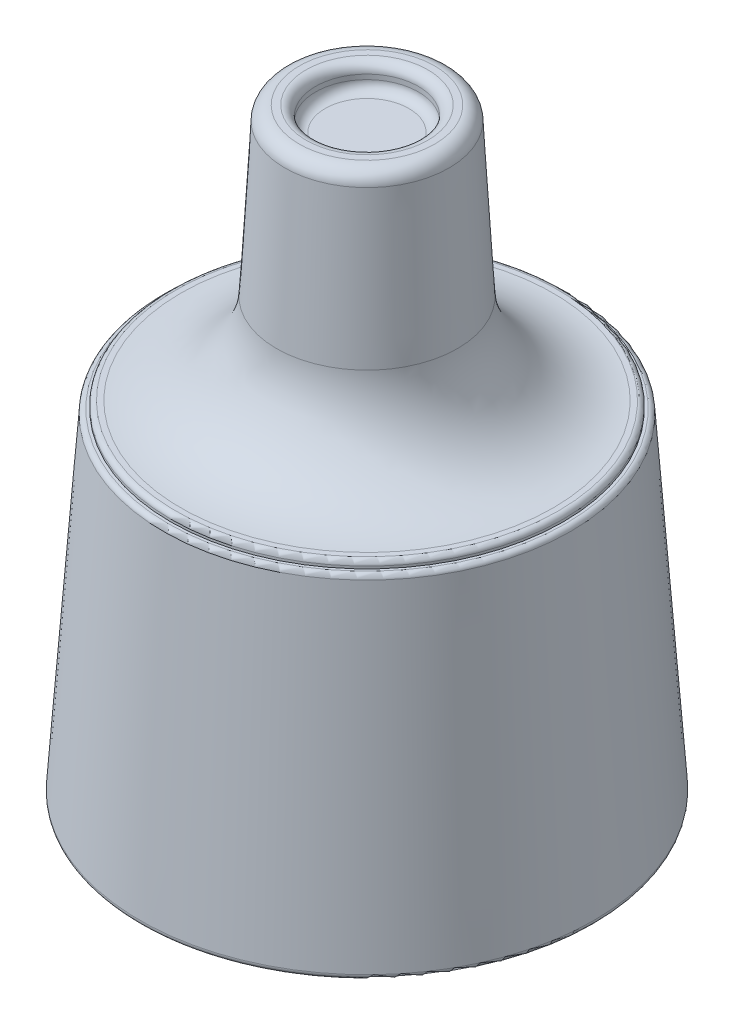
ISO-10303-21;
HEADER;
FILE_DESCRIPTION(('STEP AP214'),'2;1');
FILE_NAME('part.step','',(''),(''),'','','');
FILE_SCHEMA(('AUTOMOTIVE_DESIGN { 1 0 10303 214 1 1 1 1 }'));
ENDSEC;
DATA;
#1=APPLICATION_CONTEXT('core data for automotive mechanical design processes');
#2=APPLICATION_PROTOCOL_DEFINITION('international standard','automotive_design',2000,#1);
#3=PRODUCT_CONTEXT('',#1,'mechanical');
#4=PRODUCT('Part','Part','',(#3));
#5=PRODUCT_RELATED_PRODUCT_CATEGORY('part','',(#4));
#6=PRODUCT_DEFINITION_FORMATION('','',#4);
#7=PRODUCT_DEFINITION_CONTEXT('part definition',#1,'design');
#8=PRODUCT_DEFINITION('design','',#6,#7);
#9=PRODUCT_DEFINITION_SHAPE('','',#8);
#10=(LENGTH_UNIT() NAMED_UNIT(*) SI_UNIT(.MILLI.,.METRE.));
#11=(NAMED_UNIT(*) PLANE_ANGLE_UNIT() SI_UNIT($,.RADIAN.));
#12=(NAMED_UNIT(*) SI_UNIT($,.STERADIAN.) SOLID_ANGLE_UNIT());
#13=UNCERTAINTY_MEASURE_WITH_UNIT(LENGTH_MEASURE(1.E-05),#10,'distance_accuracy_value','');
#14=(GEOMETRIC_REPRESENTATION_CONTEXT(3) GLOBAL_UNCERTAINTY_ASSIGNED_CONTEXT((#13)) GLOBAL_UNIT_ASSIGNED_CONTEXT((#10,
#11,#12)) REPRESENTATION_CONTEXT('',''));
#15=CARTESIAN_POINT('',(0.,0.,0.));
#16=DIRECTION('',(0.,0.,1.));
#17=DIRECTION('',(1.,0.,0.));
#18=AXIS2_PLACEMENT_3D('',#15,#16,#17);
#19=CARTESIAN_POINT('',(0.,0.,0.));
#20=DIRECTION('',(0.,1.,0.));
#21=DIRECTION('',(-1.,0.,0.));
#22=AXIS2_PLACEMENT_3D('',#19,#20,#21);
#23=CYLINDRICAL_SURFACE('',#22,7.5);
#24=CARTESIAN_POINT('',(0.,0.4,0.));
#25=DIRECTION('',(0.,1.,0.));
#26=DIRECTION('',(-1.,0.,0.));
#27=AXIS2_PLACEMENT_3D('',#24,#25,#26);
#28=CIRCLE('',#27,7.5);
#29=CARTESIAN_POINT('',(-7.5,0.4,0.));
#30=VERTEX_POINT('',#29);
#31=EDGE_CURVE('E57',#30,#30,#28,.T.);
#32=ORIENTED_EDGE('',*,*,#31,.T.);
#33=EDGE_LOOP('',(#32));
#34=FACE_BOUND('',#33,.T.);
#35=CARTESIAN_POINT('',(0.,0.,0.));
#36=DIRECTION('',(0.,1.,0.));
#37=DIRECTION('',(-1.,0.,0.));
#38=AXIS2_PLACEMENT_3D('',#35,#36,#37);
#39=CIRCLE('',#38,7.5);
#40=CARTESIAN_POINT('',(-7.5,0.,0.));
#41=VERTEX_POINT('',#40);
#42=EDGE_CURVE('E62',#41,#41,#39,.T.);
#43=ORIENTED_EDGE('',*,*,#42,.F.);
#44=EDGE_LOOP('',(#43));
#45=FACE_BOUND('',#44,.T.);
#46=ADVANCED_FACE('F39',(#34,#45),#23,.F.);
#47=CARTESIAN_POINT('',(2.15,23.6,0.));
#48=DIRECTION('',(0.,-1.,0.));
#49=DIRECTION('',(1.,0.,0.));
#50=AXIS2_PLACEMENT_3D('',#47,#48,#49);
#51=PLANE('',#50);
#52=CARTESIAN_POINT('',(0.,23.6,0.));
#53=DIRECTION('',(0.,-1.,0.));
#54=DIRECTION('',(1.,0.,0.));
#55=AXIS2_PLACEMENT_3D('',#52,#53,#54);
#56=CIRCLE('',#55,1.75);
#57=CARTESIAN_POINT('',(1.75,23.6,0.));
#58=VERTEX_POINT('',#57);
#59=EDGE_CURVE('E392',#58,#58,#56,.T.);
#60=ORIENTED_EDGE('',*,*,#59,.T.);
#61=EDGE_LOOP('',(#60));
#62=FACE_BOUND('',#61,.T.);
#63=ADVANCED_FACE('F137',(#62),#51,.T.);
#64=CARTESIAN_POINT('',(0.,0.,0.));
#65=DIRECTION('',(0.,1.,0.));
#66=DIRECTION('',(-1.,0.,0.));
#67=AXIS2_PLACEMENT_3D('',#64,#65,#66);
#68=CYLINDRICAL_SURFACE('',#67,2.55);
#69=CARTESIAN_POINT('',(0.,24.4,0.));
#70=DIRECTION('',(0.,1.,0.));
#71=DIRECTION('',(-1.,0.,0.));
#72=AXIS2_PLACEMENT_3D('',#69,#70,#71);
#73=CIRCLE('',#72,2.55);
#74=CARTESIAN_POINT('',(-2.55,24.4,0.));
#75=VERTEX_POINT('',#74);
#76=EDGE_CURVE('E385',#75,#75,#73,.T.);
#77=ORIENTED_EDGE('',*,*,#76,.T.);
#78=EDGE_LOOP('',(#77));
#79=FACE_BOUND('',#78,.T.);
#80=CARTESIAN_POINT('',(0.,24.6,0.));
#81=DIRECTION('',(0.,-1.,0.));
#82=DIRECTION('',(1.,0.,0.));
#83=AXIS2_PLACEMENT_3D('',#80,#81,#82);
#84=CIRCLE('',#83,2.55);
#85=CARTESIAN_POINT('',(2.55,24.6,0.));
#86=VERTEX_POINT('',#85);
#87=EDGE_CURVE('E388',#86,#86,#84,.F.);
#88=ORIENTED_EDGE('',*,*,#87,.F.);
#89=EDGE_LOOP('',(#88));
#90=FACE_BOUND('',#89,.T.);
#91=ADVANCED_FACE('F142',(#79,#90),#68,.T.);
#92=CARTESIAN_POINT('',(3.4,24.6,0.));
#93=DIRECTION('',(0.,-1.,0.));
#94=DIRECTION('',(1.,0.,0.));
#95=AXIS2_PLACEMENT_3D('',#92,#93,#94);
#96=PLANE('',#95);
#97=CARTESIAN_POINT('',(0.,24.6,0.));
#98=DIRECTION('',(0.,-1.,0.));
#99=DIRECTION('',(1.,0.,0.));
#100=AXIS2_PLACEMENT_3D('',#97,#98,#99);
#101=CIRCLE('',#100,2.83270228635715);
#102=CARTESIAN_POINT('',(2.83270228635715,24.6,0.));
#103=VERTEX_POINT('',#102);
#104=EDGE_CURVE('E403',#103,#103,#101,.T.);
#105=ORIENTED_EDGE('',*,*,#104,.T.);
#106=EDGE_LOOP('',(#105));
#107=FACE_BOUND('',#106,.T.);
#108=ORIENTED_EDGE('',*,*,#87,.T.);
#109=EDGE_LOOP('',(#108));
#110=FACE_BOUND('',#109,.T.);
#111=ADVANCED_FACE('F349',(#107,#110),#96,.T.);
#112=CARTESIAN_POINT('',(0.,14.2776052745808,0.));
#113=DIRECTION('',(0.,-1.,0.));
#114=DIRECTION('',(1.,0.,0.));
#115=AXIS2_PLACEMENT_3D('',#112,#113,#114);
#116=CONICAL_SURFACE('',#115,3.60062739669151,0.0560161035431792);
#117=CARTESIAN_POINT('',(0.,24.4111973627096,0.));
#118=DIRECTION('',(0.,-1.,0.));
#119=DIRECTION('',(1.,0.,0.));
#120=AXIS2_PLACEMENT_3D('',#117,#118,#119);
#121=CIRCLE('',#120,3.03238858801139);
#122=CARTESIAN_POINT('',(3.03238858801139,24.4111973627096,0.));
#123=VERTEX_POINT('',#122);
#124=EDGE_CURVE('E407',#123,#123,#121,.F.);
#125=ORIENTED_EDGE('',*,*,#124,.T.);
#126=EDGE_LOOP('',(#125));
#127=FACE_BOUND('',#126,.T.);
#128=CARTESIAN_POINT('',(0.,18.0536580203892,0.));
#129=DIRECTION('',(0.,-1.,0.));
#130=DIRECTION('',(1.,0.,0.));
#131=AXIS2_PLACEMENT_3D('',#128,#129,#130);
#132=CIRCLE('',#131,3.38888612122562);
#133=CARTESIAN_POINT('',(3.38888612122562,18.0536580203892,0.));
#134=VERTEX_POINT('',#133);
#135=EDGE_CURVE('E397',#134,#134,#132,.T.);
#136=ORIENTED_EDGE('',*,*,#135,.T.);
#137=EDGE_LOOP('',(#136));
#138=FACE_BOUND('',#137,.T.);
#139=ADVANCED_FACE('F339',(#127,#138),#116,.F.);
#140=CARTESIAN_POINT('',(8.2,13.9,0.));
#141=DIRECTION('',(0.,-1.,0.));
#142=DIRECTION('',(1.,0.,0.));
#143=AXIS2_PLACEMENT_3D('',#140,#141,#142);
#144=PLANE('',#143);
#145=CARTESIAN_POINT('',(0.,13.9,0.));
#146=DIRECTION('',(0.,-1.,0.));
#147=DIRECTION('',(1.,0.,0.));
#148=AXIS2_PLACEMENT_3D('',#145,#146,#147);
#149=CIRCLE('',#148,7.8);
#150=CARTESIAN_POINT('',(7.8,13.9,0.));
#151=VERTEX_POINT('',#150);
#152=EDGE_CURVE('E53',#151,#151,#149,.F.);
#153=ORIENTED_EDGE('',*,*,#152,.F.);
#154=EDGE_LOOP('',(#153));
#155=FACE_BOUND('',#154,.T.);
#156=CARTESIAN_POINT('',(0.,13.9,0.));
#157=DIRECTION('',(0.,-1.,0.));
#158=DIRECTION('',(1.,0.,0.));
#159=AXIS2_PLACEMENT_3D('',#156,#157,#158);
#160=CIRCLE('',#159,7.78198475761901);
#161=CARTESIAN_POINT('',(7.78198475761901,13.9,0.));
#162=VERTEX_POINT('',#161);
#163=EDGE_CURVE('E391',#162,#162,#160,.F.);
#164=ORIENTED_EDGE('',*,*,#163,.T.);
#165=EDGE_LOOP('',(#164));
#166=FACE_BOUND('',#165,.T.);
#167=ADVANCED_FACE('F329',(#155,#166),#144,.T.);
#168=CARTESIAN_POINT('',(0.,0.,0.));
#169=DIRECTION('',(0.,1.,0.));
#170=DIRECTION('',(-1.,0.,0.));
#171=AXIS2_PLACEMENT_3D('',#168,#169,#170);
#172=CYLINDRICAL_SURFACE('',#171,7.8);
#173=ORIENTED_EDGE('',*,*,#152,.T.);
#174=EDGE_LOOP('',(#173));
#175=FACE_BOUND('',#174,.T.);
#176=CARTESIAN_POINT('',(0.,13.6,0.));
#177=DIRECTION('',(0.,-1.,0.));
#178=DIRECTION('',(1.,0.,0.));
#179=AXIS2_PLACEMENT_3D('',#176,#177,#178);
#180=CIRCLE('',#179,7.8);
#181=CARTESIAN_POINT('',(7.8,13.6,0.));
#182=VERTEX_POINT('',#181);
#183=EDGE_CURVE('E61',#182,#182,#180,.F.);
#184=ORIENTED_EDGE('',*,*,#183,.F.);
#185=EDGE_LOOP('',(#184));
#186=FACE_BOUND('',#185,.T.);
#187=ADVANCED_FACE('F320',(#175,#186),#172,.F.);
#188=CARTESIAN_POINT('',(8.5,13.6,0.));
#189=DIRECTION('',(0.,-1.,0.));
#190=DIRECTION('',(1.,0.,0.));
#191=AXIS2_PLACEMENT_3D('',#188,#189,#190);
#192=PLANE('',#191);
#193=CARTESIAN_POINT('',(0.,13.6,0.));
#194=DIRECTION('',(0.,-1.,0.));
#195=DIRECTION('',(1.,0.,0.));
#196=AXIS2_PLACEMENT_3D('',#193,#194,#195);
#197=CIRCLE('',#196,8.12755231863948);
#198=CARTESIAN_POINT('',(8.12755231863948,13.6,0.));
#199=VERTEX_POINT('',#198);
#200=EDGE_CURVE('E47',#199,#199,#197,.F.);
#201=ORIENTED_EDGE('',*,*,#200,.F.);
#202=EDGE_LOOP('',(#201));
#203=FACE_BOUND('',#202,.T.);
#204=ORIENTED_EDGE('',*,*,#183,.T.);
#205=EDGE_LOOP('',(#204));
#206=FACE_BOUND('',#205,.T.);
#207=ADVANCED_FACE('F159',(#203,#206),#192,.T.);
#208=CARTESIAN_POINT('',(0.,-0.0284988199951638,0.));
#209=DIRECTION('',(0.,-1.,0.));
#210=DIRECTION('',(1.,0.,0.));
#211=AXIS2_PLACEMENT_3D('',#208,#209,#210);
#212=CONICAL_SURFACE('',#211,9.10101652006771,0.0713074647852903);
#213=ORIENTED_EDGE('',*,*,#200,.T.);
#214=EDGE_LOOP('',(#213));
#215=FACE_BOUND('',#214,.T.);
#216=CARTESIAN_POINT('',(0.,0.4,0.));
#217=DIRECTION('',(0.,1.,0.));
#218=DIRECTION('',(-1.,0.,0.));
#219=AXIS2_PLACEMENT_3D('',#216,#217,#218);
#220=CIRCLE('',#219,9.07040946149662);
#221=CARTESIAN_POINT('',(-9.07040946149662,0.4,0.));
#222=VERTEX_POINT('',#221);
#223=EDGE_CURVE('E10',#222,#222,#220,.T.);
#224=ORIENTED_EDGE('',*,*,#223,.F.);
#225=EDGE_LOOP('',(#224));
#226=FACE_BOUND('',#225,.T.);
#227=ADVANCED_FACE('F150',(#215,#226),#212,.F.);
#228=CARTESIAN_POINT('',(7.5,0.4,0.));
#229=DIRECTION('',(0.,1.,0.));
#230=DIRECTION('',(-1.,0.,0.));
#231=AXIS2_PLACEMENT_3D('',#228,#229,#230);
#232=PLANE('',#231);
#233=ORIENTED_EDGE('',*,*,#223,.T.);
#234=EDGE_LOOP('',(#233));
#235=FACE_BOUND('',#234,.T.);
#236=ORIENTED_EDGE('',*,*,#31,.F.);
#237=EDGE_LOOP('',(#236));
#238=FACE_BOUND('',#237,.T.);
#239=ADVANCED_FACE('F147',(#235,#238),#232,.T.);
#240=CARTESIAN_POINT('',(0.,24.4,0.));
#241=DIRECTION('',(0.,-1.,0.));
#242=DIRECTION('',(1.,0.,0.));
#243=AXIS2_PLACEMENT_3D('',#240,#241,#242);
#244=TOROIDAL_SURFACE('',#243,1.75,0.8);
#245=ORIENTED_EDGE('',*,*,#59,.F.);
#246=EDGE_LOOP('',(#245));
#247=FACE_BOUND('',#246,.T.);
#248=ORIENTED_EDGE('',*,*,#76,.F.);
#249=EDGE_LOOP('',(#248));
#250=FACE_BOUND('',#249,.T.);
#251=ADVANCED_FACE('F149',(#247,#250),#244,.T.);
#252=CARTESIAN_POINT('',(0.,18.3,0.));
#253=DIRECTION('',(0.,-1.,0.));
#254=DIRECTION('',(1.,0.,0.));
#255=AXIS2_PLACEMENT_3D('',#252,#253,#254);
#256=TOROIDAL_SURFACE('',#255,7.78198475761901,4.4);
#257=ORIENTED_EDGE('',*,*,#135,.F.);
#258=EDGE_LOOP('',(#257));
#259=FACE_BOUND('',#258,.T.);
#260=ORIENTED_EDGE('',*,*,#163,.F.);
#261=EDGE_LOOP('',(#260));
#262=FACE_BOUND('',#261,.T.);
#263=ADVANCED_FACE('F156',(#259,#262),#256,.T.);
#264=CARTESIAN_POINT('',(0.,24.4,0.));
#265=DIRECTION('',(0.,-1.,0.));
#266=DIRECTION('',(1.,0.,0.));
#267=AXIS2_PLACEMENT_3D('',#264,#265,#266);
#268=TOROIDAL_SURFACE('',#267,2.83270228635715,0.2);
#269=ORIENTED_EDGE('',*,*,#104,.F.);
#270=EDGE_LOOP('',(#269));
#271=FACE_BOUND('',#270,.T.);
#272=ORIENTED_EDGE('',*,*,#124,.F.);
#273=EDGE_LOOP('',(#272));
#274=FACE_BOUND('',#273,.T.);
#275=ADVANCED_FACE('F166',(#271,#274),#268,.F.);
#276=CARTESIAN_POINT('',(2.15,24.,0.));
#277=DIRECTION('',(0.,-1.,0.));
#278=DIRECTION('',(1.,0.,0.));
#279=AXIS2_PLACEMENT_3D('',#276,#277,#278);
#280=PLANE('',#279);
#281=CARTESIAN_POINT('',(0.,24.,0.));
#282=DIRECTION('',(0.,-1.,0.));
#283=DIRECTION('',(1.,0.,0.));
#284=AXIS2_PLACEMENT_3D('',#281,#282,#283);
#285=CIRCLE('',#284,1.75);
#286=CARTESIAN_POINT('',(1.75,24.,0.));
#287=VERTEX_POINT('',#286);
#288=EDGE_CURVE('E78',#287,#287,#285,.T.);
#289=ORIENTED_EDGE('',*,*,#288,.F.);
#290=EDGE_LOOP('',(#289));
#291=FACE_BOUND('',#290,.T.);
#292=ADVANCED_FACE('F169',(#291),#280,.F.);
#293=CARTESIAN_POINT('',(0.,0.,0.));
#294=DIRECTION('',(0.,1.,0.));
#295=DIRECTION('',(-1.,0.,0.));
#296=AXIS2_PLACEMENT_3D('',#293,#294,#295);
#297=CYLINDRICAL_SURFACE('',#296,2.15);
#298=CARTESIAN_POINT('',(0.,24.4,0.));
#299=DIRECTION('',(0.,-1.,0.));
#300=DIRECTION('',(1.,0.,0.));
#301=AXIS2_PLACEMENT_3D('',#298,#299,#300);
#302=CIRCLE('',#301,2.15);
#303=CARTESIAN_POINT('',(2.15,24.4,0.));
#304=VERTEX_POINT('',#303);
#305=EDGE_CURVE('E74',#304,#304,#302,.F.);
#306=ORIENTED_EDGE('',*,*,#305,.F.);
#307=EDGE_LOOP('',(#306));
#308=FACE_BOUND('',#307,.T.);
#309=CARTESIAN_POINT('',(0.,24.6,0.));
#310=DIRECTION('',(0.,-1.,0.));
#311=DIRECTION('',(1.,0.,0.));
#312=AXIS2_PLACEMENT_3D('',#309,#310,#311);
#313=CIRCLE('',#312,2.15);
#314=CARTESIAN_POINT('',(2.15,24.6,0.));
#315=VERTEX_POINT('',#314);
#316=EDGE_CURVE('E70',#315,#315,#313,.T.);
#317=ORIENTED_EDGE('',*,*,#316,.F.);
#318=EDGE_LOOP('',(#317));
#319=FACE_BOUND('',#318,.T.);
#320=ADVANCED_FACE('F194',(#308,#319),#297,.F.);
#321=CARTESIAN_POINT('',(3.4,25.,0.));
#322=DIRECTION('',(0.,-1.,0.));
#323=DIRECTION('',(1.,0.,0.));
#324=AXIS2_PLACEMENT_3D('',#321,#322,#323);
#325=PLANE('',#324);
#326=CARTESIAN_POINT('',(0.,25.,0.));
#327=DIRECTION('',(0.,-1.,0.));
#328=DIRECTION('',(1.,0.,0.));
#329=AXIS2_PLACEMENT_3D('',#326,#327,#328);
#330=CIRCLE('',#329,2.83270228635715);
#331=CARTESIAN_POINT('',(2.83270228635715,25.,0.));
#332=VERTEX_POINT('',#331);
#333=EDGE_CURVE('E98',#332,#332,#330,.T.);
#334=ORIENTED_EDGE('',*,*,#333,.F.);
#335=EDGE_LOOP('',(#334));
#336=FACE_BOUND('',#335,.T.);
#337=CARTESIAN_POINT('',(0.,25.,0.));
#338=DIRECTION('',(0.,-1.,0.));
#339=DIRECTION('',(1.,0.,0.));
#340=AXIS2_PLACEMENT_3D('',#337,#338,#339);
#341=CIRCLE('',#340,2.55);
#342=CARTESIAN_POINT('',(2.55,25.,0.));
#343=VERTEX_POINT('',#342);
#344=EDGE_CURVE('E82',#343,#343,#341,.F.);
#345=ORIENTED_EDGE('',*,*,#344,.F.);
#346=EDGE_LOOP('',(#345));
#347=FACE_BOUND('',#346,.T.);
#348=ADVANCED_FACE('F190',(#336,#347),#325,.F.);
#349=CARTESIAN_POINT('',(0.,14.3,0.));
#350=DIRECTION('',(0.,-1.,0.));
#351=DIRECTION('',(1.,0.,0.));
#352=AXIS2_PLACEMENT_3D('',#349,#350,#351);
#353=CONICAL_SURFACE('',#352,4.,0.0560161035431792);
#354=CARTESIAN_POINT('',(0.,24.4335920881288,0.));
#355=DIRECTION('',(0.,-1.,0.));
#356=DIRECTION('',(1.,0.,0.));
#357=AXIS2_PLACEMENT_3D('',#354,#355,#356);
#358=CIRCLE('',#357,3.43176119131988);
#359=CARTESIAN_POINT('',(3.43176119131988,24.4335920881288,0.));
#360=VERTEX_POINT('',#359);
#361=EDGE_CURVE('E94',#360,#360,#358,.F.);
#362=ORIENTED_EDGE('',*,*,#361,.F.);
#363=EDGE_LOOP('',(#362));
#364=FACE_BOUND('',#363,.T.);
#365=CARTESIAN_POINT('',(0.,18.0760527458083,0.));
#366=DIRECTION('',(0.,1.,0.));
#367=DIRECTION('',(-1.,0.,0.));
#368=AXIS2_PLACEMENT_3D('',#365,#366,#367);
#369=CIRCLE('',#368,3.78825872453411);
#370=CARTESIAN_POINT('',(-3.78825872453411,18.0760527458083,0.));
#371=VERTEX_POINT('',#370);
#372=EDGE_CURVE('E90',#371,#371,#369,.F.);
#373=ORIENTED_EDGE('',*,*,#372,.F.);
#374=EDGE_LOOP('',(#373));
#375=FACE_BOUND('',#374,.T.);
#376=ADVANCED_FACE('F186',(#364,#375),#353,.T.);
#377=CARTESIAN_POINT('',(8.2,14.3,0.));
#378=DIRECTION('',(0.,-1.,0.));
#379=DIRECTION('',(1.,0.,0.));
#380=AXIS2_PLACEMENT_3D('',#377,#378,#379);
#381=PLANE('',#380);
#382=CARTESIAN_POINT('',(0.,14.3,0.));
#383=DIRECTION('',(0.,-1.,0.));
#384=DIRECTION('',(1.,0.,0.));
#385=AXIS2_PLACEMENT_3D('',#382,#383,#384);
#386=CIRCLE('',#385,8.);
#387=CARTESIAN_POINT('',(8.,14.3,0.));
#388=VERTEX_POINT('',#387);
#389=EDGE_CURVE('E106',#388,#388,#386,.T.);
#390=ORIENTED_EDGE('',*,*,#389,.F.);
#391=EDGE_LOOP('',(#390));
#392=FACE_BOUND('',#391,.T.);
#393=CARTESIAN_POINT('',(0.,14.3,0.));
#394=DIRECTION('',(0.,-1.,0.));
#395=DIRECTION('',(1.,0.,0.));
#396=AXIS2_PLACEMENT_3D('',#393,#394,#395);
#397=CIRCLE('',#396,7.78198475761901);
#398=CARTESIAN_POINT('',(7.78198475761901,14.3,0.));
#399=VERTEX_POINT('',#398);
#400=EDGE_CURVE('E86',#399,#399,#397,.F.);
#401=ORIENTED_EDGE('',*,*,#400,.F.);
#402=EDGE_LOOP('',(#401));
#403=FACE_BOUND('',#402,.T.);
#404=ADVANCED_FACE('F182',(#392,#403),#381,.F.);
#405=CARTESIAN_POINT('',(0.,0.,0.));
#406=DIRECTION('',(0.,1.,0.));
#407=DIRECTION('',(-1.,0.,0.));
#408=AXIS2_PLACEMENT_3D('',#405,#406,#407);
#409=CYLINDRICAL_SURFACE('',#408,8.2);
#410=CARTESIAN_POINT('',(0.,14.1,0.));
#411=DIRECTION('',(0.,-1.,0.));
#412=DIRECTION('',(1.,0.,0.));
#413=AXIS2_PLACEMENT_3D('',#410,#411,#412);
#414=CIRCLE('',#413,8.2);
#415=CARTESIAN_POINT('',(8.2,14.1,0.));
#416=VERTEX_POINT('',#415);
#417=EDGE_CURVE('E102',#416,#416,#414,.F.);
#418=ORIENTED_EDGE('',*,*,#417,.F.);
#419=EDGE_LOOP('',(#418));
#420=FACE_BOUND('',#419,.T.);
#421=CARTESIAN_POINT('',(0.,14.,0.));
#422=DIRECTION('',(0.,1.,0.));
#423=DIRECTION('',(-1.,0.,0.));
#424=AXIS2_PLACEMENT_3D('',#421,#422,#423);
#425=CIRCLE('',#424,8.2);
#426=CARTESIAN_POINT('',(-8.2,14.,0.));
#427=VERTEX_POINT('',#426);
#428=EDGE_CURVE('E66',#427,#427,#425,.T.);
#429=ORIENTED_EDGE('',*,*,#428,.T.);
#430=EDGE_LOOP('',(#429));
#431=FACE_BOUND('',#430,.T.);
#432=ADVANCED_FACE('F178',(#420,#431),#409,.T.);
#433=CARTESIAN_POINT('',(8.5,14.,0.));
#434=DIRECTION('',(0.,-1.,0.));
#435=DIRECTION('',(1.,0.,0.));
#436=AXIS2_PLACEMENT_3D('',#433,#434,#435);
#437=PLANE('',#436);
#438=CARTESIAN_POINT('',(0.,14.,0.));
#439=DIRECTION('',(0.,-1.,0.));
#440=DIRECTION('',(1.,0.,0.));
#441=AXIS2_PLACEMENT_3D('',#438,#439,#440);
#442=CIRCLE('',#441,8.31377615931974);
#443=CARTESIAN_POINT('',(8.31377615931974,14.,0.));
#444=VERTEX_POINT('',#443);
#445=EDGE_CURVE('E117',#444,#444,#442,.T.);
#446=ORIENTED_EDGE('',*,*,#445,.F.);
#447=EDGE_LOOP('',(#446));
#448=FACE_BOUND('',#447,.T.);
#449=ORIENTED_EDGE('',*,*,#428,.F.);
#450=EDGE_LOOP('',(#449));
#451=FACE_BOUND('',#450,.T.);
#452=ADVANCED_FACE('F174',(#448,#451),#437,.F.);
#453=CARTESIAN_POINT('',(0.,0.,0.));
#454=DIRECTION('',(0.,-1.,0.));
#455=DIRECTION('',(1.,0.,0.));
#456=AXIS2_PLACEMENT_3D('',#453,#454,#455);
#457=CONICAL_SURFACE('',#456,9.5,0.0713074647852903);
#458=CARTESIAN_POINT('',(0.,13.8142494099976,0.));
#459=DIRECTION('',(0.,-1.,0.));
#460=DIRECTION('',(1.,0.,0.));
#461=AXIS2_PLACEMENT_3D('',#458,#459,#460);
#462=CIRCLE('',#461,8.51326789928589);
#463=CARTESIAN_POINT('',(8.51326789928589,13.8142494099976,0.));
#464=VERTEX_POINT('',#463);
#465=EDGE_CURVE('E114',#464,#464,#462,.F.);
#466=ORIENTED_EDGE('',*,*,#465,.F.);
#467=EDGE_LOOP('',(#466));
#468=FACE_BOUND('',#467,.T.);
#469=CARTESIAN_POINT('',(0.,0.214249409997582,0.));
#470=DIRECTION('',(0.,-1.,0.));
#471=DIRECTION('',(1.,0.,0.));
#472=AXIS2_PLACEMENT_3D('',#469,#470,#471);
#473=CIRCLE('',#472,9.48469647071446);
#474=CARTESIAN_POINT('',(9.48469647071446,0.214249409997582,0.));
#475=VERTEX_POINT('',#474);
#476=EDGE_CURVE('E110',#475,#475,#473,.T.);
#477=ORIENTED_EDGE('',*,*,#476,.F.);
#478=EDGE_LOOP('',(#477));
#479=FACE_BOUND('',#478,.T.);
#480=ADVANCED_FACE('F132',(#468,#479),#457,.T.);
#481=CARTESIAN_POINT('',(7.5,0.,0.));
#482=DIRECTION('',(0.,1.,0.));
#483=DIRECTION('',(-1.,0.,0.));
#484=AXIS2_PLACEMENT_3D('',#481,#482,#483);
#485=PLANE('',#484);
#486=CARTESIAN_POINT('',(0.,0.,0.));
#487=DIRECTION('',(0.,1.,0.));
#488=DIRECTION('',(-1.,0.,0.));
#489=AXIS2_PLACEMENT_3D('',#486,#487,#488);
#490=CIRCLE('',#489,9.28520473074831);
#491=CARTESIAN_POINT('',(-9.28520473074831,0.,0.));
#492=VERTEX_POINT('',#491);
#493=EDGE_CURVE('E42',#492,#492,#490,.T.);
#494=ORIENTED_EDGE('',*,*,#493,.F.);
#495=EDGE_LOOP('',(#494));
#496=FACE_BOUND('',#495,.T.);
#497=ORIENTED_EDGE('',*,*,#42,.T.);
#498=EDGE_LOOP('',(#497));
#499=FACE_BOUND('',#498,.T.);
#500=ADVANCED_FACE('F128',(#496,#499),#485,.F.);
#501=CARTESIAN_POINT('',(0.,24.4,0.));
#502=DIRECTION('',(0.,-1.,0.));
#503=DIRECTION('',(1.,0.,0.));
#504=AXIS2_PLACEMENT_3D('',#501,#502,#503);
#505=TOROIDAL_SURFACE('',#504,1.75,0.4);
#506=ORIENTED_EDGE('',*,*,#288,.T.);
#507=EDGE_LOOP('',(#506));
#508=FACE_BOUND('',#507,.T.);
#509=ORIENTED_EDGE('',*,*,#305,.T.);
#510=EDGE_LOOP('',(#509));
#511=FACE_BOUND('',#510,.T.);
#512=ADVANCED_FACE('F131',(#508,#511),#505,.F.);
#513=CARTESIAN_POINT('',(0.,24.6,0.));
#514=DIRECTION('',(0.,-1.,0.));
#515=DIRECTION('',(1.,0.,0.));
#516=AXIS2_PLACEMENT_3D('',#513,#514,#515);
#517=TOROIDAL_SURFACE('',#516,2.55,0.4);
#518=ORIENTED_EDGE('',*,*,#316,.T.);
#519=EDGE_LOOP('',(#518));
#520=FACE_BOUND('',#519,.T.);
#521=ORIENTED_EDGE('',*,*,#344,.T.);
#522=EDGE_LOOP('',(#521));
#523=FACE_BOUND('',#522,.T.);
#524=ADVANCED_FACE('F204',(#520,#523),#517,.T.);
#525=CARTESIAN_POINT('',(0.,18.3,0.));
#526=DIRECTION('',(0.,-1.,0.));
#527=DIRECTION('',(1.,0.,0.));
#528=AXIS2_PLACEMENT_3D('',#525,#526,#527);
#529=TOROIDAL_SURFACE('',#528,7.78198475761901,4.);
#530=ORIENTED_EDGE('',*,*,#372,.T.);
#531=EDGE_LOOP('',(#530));
#532=FACE_BOUND('',#531,.T.);
#533=ORIENTED_EDGE('',*,*,#400,.T.);
#534=EDGE_LOOP('',(#533));
#535=FACE_BOUND('',#534,.T.);
#536=ADVANCED_FACE('F208',(#532,#535),#529,.F.);
#537=CARTESIAN_POINT('',(0.,24.4,0.));
#538=DIRECTION('',(0.,-1.,0.));
#539=DIRECTION('',(1.,0.,0.));
#540=AXIS2_PLACEMENT_3D('',#537,#538,#539);
#541=TOROIDAL_SURFACE('',#540,2.83270228635715,0.6);
#542=ORIENTED_EDGE('',*,*,#333,.T.);
#543=EDGE_LOOP('',(#542));
#544=FACE_BOUND('',#543,.T.);
#545=ORIENTED_EDGE('',*,*,#361,.T.);
#546=EDGE_LOOP('',(#545));
#547=FACE_BOUND('',#546,.T.);
#548=ADVANCED_FACE('F212',(#544,#547),#541,.T.);
#549=CARTESIAN_POINT('',(0.,14.1,0.));
#550=DIRECTION('',(0.,-1.,0.));
#551=DIRECTION('',(1.,0.,0.));
#552=AXIS2_PLACEMENT_3D('',#549,#550,#551);
#553=TOROIDAL_SURFACE('',#552,8.,0.2);
#554=ORIENTED_EDGE('',*,*,#389,.T.);
#555=EDGE_LOOP('',(#554));
#556=FACE_BOUND('',#555,.T.);
#557=ORIENTED_EDGE('',*,*,#417,.T.);
#558=EDGE_LOOP('',(#557));
#559=FACE_BOUND('',#558,.T.);
#560=ADVANCED_FACE('F216',(#556,#559),#553,.T.);
#561=CARTESIAN_POINT('',(0.,13.8,0.));
#562=DIRECTION('',(0.,-1.,0.));
#563=DIRECTION('',(1.,0.,0.));
#564=AXIS2_PLACEMENT_3D('',#561,#562,#563);
#565=TOROIDAL_SURFACE('',#564,8.31377615931974,0.2);
#566=ORIENTED_EDGE('',*,*,#445,.T.);
#567=EDGE_LOOP('',(#566));
#568=FACE_BOUND('',#567,.T.);
#569=ORIENTED_EDGE('',*,*,#465,.T.);
#570=EDGE_LOOP('',(#569));
#571=FACE_BOUND('',#570,.T.);
#572=ADVANCED_FACE('F220',(#568,#571),#565,.T.);
#573=CARTESIAN_POINT('',(0.,0.2,0.));
#574=DIRECTION('',(0.,1.,0.));
#575=DIRECTION('',(-1.,0.,0.));
#576=AXIS2_PLACEMENT_3D('',#573,#574,#575);
#577=TOROIDAL_SURFACE('',#576,9.28520473074831,0.2);
#578=ORIENTED_EDGE('',*,*,#476,.T.);
#579=EDGE_LOOP('',(#578));
#580=FACE_BOUND('',#579,.T.);
#581=ORIENTED_EDGE('',*,*,#493,.T.);
#582=EDGE_LOOP('',(#581));
#583=FACE_BOUND('',#582,.T.);
#584=ADVANCED_FACE('F126',(#580,#583),#577,.T.);
#585=CLOSED_SHELL('',(#46,#63,#91,#111,#139,#167,#187,#207,#227,#239,#251,#263,#275,#292,#320,
#348,#376,#404,#432,#452,#480,#500,#512,#524,#536,#548,#560,#572,#584));
#586=MANIFOLD_SOLID_BREP('B2',#585);
#587=ADVANCED_BREP_SHAPE_REPRESENTATION('',(#18,#586),#14);
#588=SHAPE_DEFINITION_REPRESENTATION(#9,#587);
ENDSEC;
END-ISO-10303-21;
